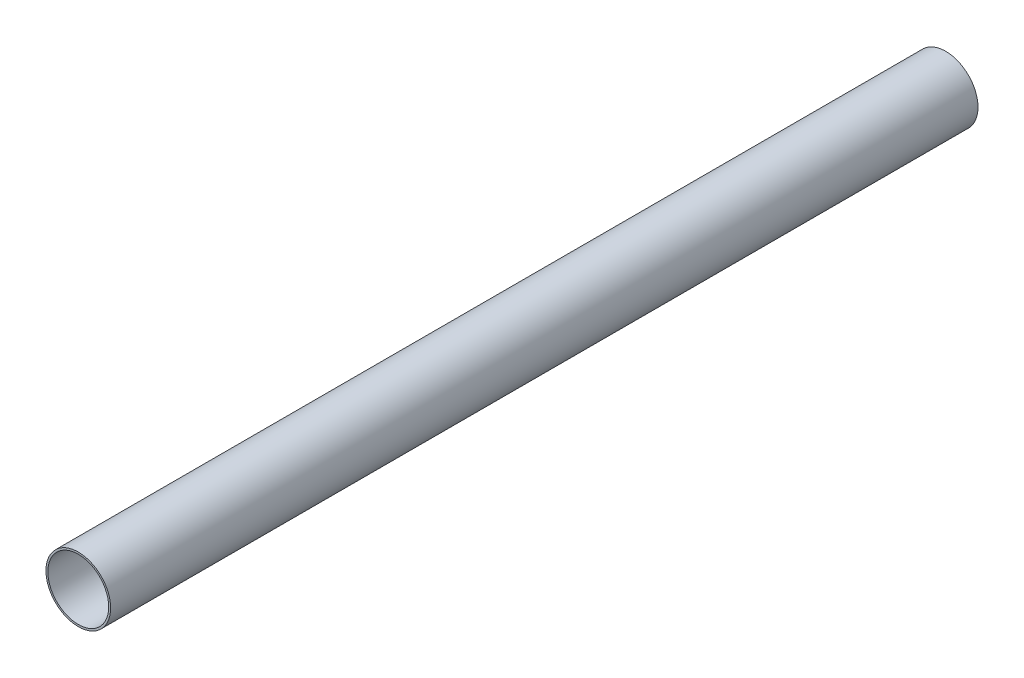
ISO-10303-21;
HEADER;
FILE_DESCRIPTION(('STEP AP214'),'2;1');
FILE_NAME('part.step','',(''),(''),'','','');
FILE_SCHEMA(('AUTOMOTIVE_DESIGN { 1 0 10303 214 1 1 1 1 }'));
ENDSEC;
DATA;
#1=APPLICATION_CONTEXT('core data for automotive mechanical design processes');
#2=APPLICATION_PROTOCOL_DEFINITION('international standard','automotive_design',2000,#1);
#3=PRODUCT_CONTEXT('',#1,'mechanical');
#4=PRODUCT('Part','Part','',(#3));
#5=PRODUCT_RELATED_PRODUCT_CATEGORY('part','',(#4));
#6=PRODUCT_DEFINITION_FORMATION('','',#4);
#7=PRODUCT_DEFINITION_CONTEXT('part definition',#1,'design');
#8=PRODUCT_DEFINITION('design','',#6,#7);
#9=PRODUCT_DEFINITION_SHAPE('','',#8);
#10=(LENGTH_UNIT() NAMED_UNIT(*) SI_UNIT(.MILLI.,.METRE.));
#11=(NAMED_UNIT(*) PLANE_ANGLE_UNIT() SI_UNIT($,.RADIAN.));
#12=(NAMED_UNIT(*) SI_UNIT($,.STERADIAN.) SOLID_ANGLE_UNIT());
#13=UNCERTAINTY_MEASURE_WITH_UNIT(LENGTH_MEASURE(1.E-05),#10,'distance_accuracy_value','');
#14=(GEOMETRIC_REPRESENTATION_CONTEXT(3) GLOBAL_UNCERTAINTY_ASSIGNED_CONTEXT((#13)) GLOBAL_UNIT_ASSIGNED_CONTEXT((#10,
#11,#12)) REPRESENTATION_CONTEXT('',''));
#15=CARTESIAN_POINT('',(0.,0.,0.));
#16=DIRECTION('',(0.,0.,1.));
#17=DIRECTION('',(1.,0.,0.));
#18=AXIS2_PLACEMENT_3D('',#15,#16,#17);
#19=CARTESIAN_POINT('',(0.,0.,723.9));
#20=DIRECTION('',(0.,0.,1.));
#21=DIRECTION('',(1.,0.,0.));
#22=AXIS2_PLACEMENT_3D('',#19,#20,#21);
#23=PLANE('',#22);
#24=CARTESIAN_POINT('',(0.,0.,723.9));
#25=DIRECTION('',(0.,0.,1.));
#26=DIRECTION('',(1.,0.,0.));
#27=AXIS2_PLACEMENT_3D('',#24,#25,#26);
#28=CIRCLE('',#27,26.9875);
#29=CARTESIAN_POINT('',(26.9875,0.,723.9));
#30=VERTEX_POINT('',#29);
#31=EDGE_CURVE('E10',#30,#30,#28,.T.);
#32=ORIENTED_EDGE('',*,*,#31,.T.);
#33=EDGE_LOOP('',(#32));
#34=FACE_BOUND('',#33,.T.);
#35=CARTESIAN_POINT('',(0.,0.,723.9));
#36=DIRECTION('',(0.,0.,1.));
#37=DIRECTION('',(1.,0.,0.));
#38=AXIS2_PLACEMENT_3D('',#35,#36,#37);
#39=CIRCLE('',#38,25.4);
#40=CARTESIAN_POINT('',(25.4,0.,723.9));
#41=VERTEX_POINT('',#40);
#42=EDGE_CURVE('E48',#41,#41,#39,.T.);
#43=ORIENTED_EDGE('',*,*,#42,.F.);
#44=EDGE_LOOP('',(#43));
#45=FACE_BOUND('',#44,.T.);
#46=ADVANCED_FACE('F37',(#34,#45),#23,.T.);
#47=CARTESIAN_POINT('',(0.,0.,0.));
#48=DIRECTION('',(0.,0.,1.));
#49=DIRECTION('',(1.,0.,0.));
#50=AXIS2_PLACEMENT_3D('',#47,#48,#49);
#51=PLANE('',#50);
#52=CARTESIAN_POINT('',(0.,0.,0.));
#53=DIRECTION('',(0.,0.,1.));
#54=DIRECTION('',(1.,0.,0.));
#55=AXIS2_PLACEMENT_3D('',#52,#53,#54);
#56=CIRCLE('',#55,26.9875);
#57=CARTESIAN_POINT('',(26.9875,0.,0.));
#58=VERTEX_POINT('',#57);
#59=EDGE_CURVE('E41',#58,#58,#56,.T.);
#60=ORIENTED_EDGE('',*,*,#59,.F.);
#61=EDGE_LOOP('',(#60));
#62=FACE_BOUND('',#61,.T.);
#63=CARTESIAN_POINT('',(0.,0.,0.));
#64=DIRECTION('',(0.,0.,1.));
#65=DIRECTION('',(1.,0.,0.));
#66=AXIS2_PLACEMENT_3D('',#63,#64,#65);
#67=CIRCLE('',#66,25.4);
#68=CARTESIAN_POINT('',(25.4,0.,0.));
#69=VERTEX_POINT('',#68);
#70=EDGE_CURVE('E50',#69,#69,#67,.T.);
#71=ORIENTED_EDGE('',*,*,#70,.T.);
#72=EDGE_LOOP('',(#71));
#73=FACE_BOUND('',#72,.T.);
#74=ADVANCED_FACE('F60',(#62,#73),#51,.F.);
#75=CARTESIAN_POINT('',(0.,0.,723.9));
#76=DIRECTION('',(0.,0.,-1.));
#77=DIRECTION('',(-1.,0.,0.));
#78=AXIS2_PLACEMENT_3D('',#75,#76,#77);
#79=CYLINDRICAL_SURFACE('',#78,26.9875);
#80=ORIENTED_EDGE('',*,*,#31,.F.);
#81=EDGE_LOOP('',(#80));
#82=FACE_BOUND('',#81,.T.);
#83=ORIENTED_EDGE('',*,*,#59,.T.);
#84=EDGE_LOOP('',(#83));
#85=FACE_BOUND('',#84,.T.);
#86=ADVANCED_FACE('F39',(#82,#85),#79,.T.);
#87=CARTESIAN_POINT('',(0.,0.,723.9));
#88=DIRECTION('',(0.,0.,-1.));
#89=DIRECTION('',(-1.,0.,0.));
#90=AXIS2_PLACEMENT_3D('',#87,#88,#89);
#91=CYLINDRICAL_SURFACE('',#90,25.4);
#92=ORIENTED_EDGE('',*,*,#42,.T.);
#93=EDGE_LOOP('',(#92));
#94=FACE_BOUND('',#93,.T.);
#95=ORIENTED_EDGE('',*,*,#70,.F.);
#96=EDGE_LOOP('',(#95));
#97=FACE_BOUND('',#96,.T.);
#98=ADVANCED_FACE('F56',(#94,#97),#91,.F.);
#99=CLOSED_SHELL('',(#46,#74,#86,#98));
#100=MANIFOLD_SOLID_BREP('B2',#99);
#101=ADVANCED_BREP_SHAPE_REPRESENTATION('',(#18,#100),#14);
#102=SHAPE_DEFINITION_REPRESENTATION(#9,#101);
ENDSEC;
END-ISO-10303-21;
